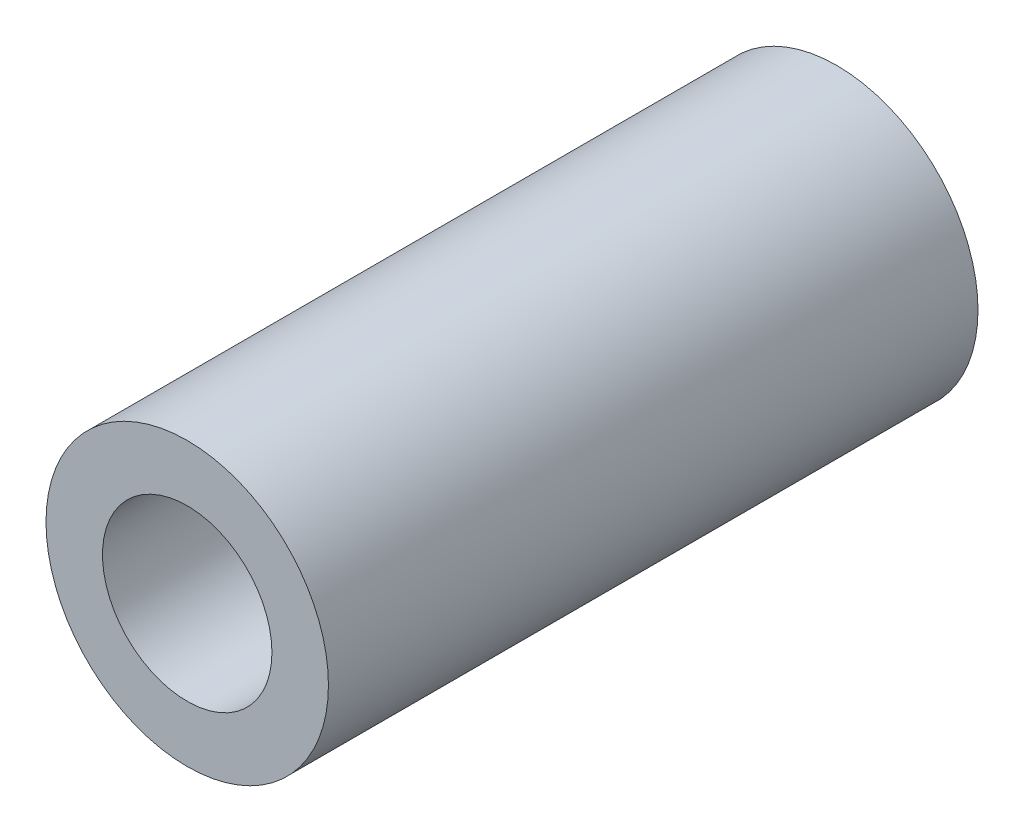
ISO-10303-21;
HEADER;
FILE_DESCRIPTION(('STEP AP214'),'2;1');
FILE_NAME('part.step','',(''),(''),'','','');
FILE_SCHEMA(('AUTOMOTIVE_DESIGN { 1 0 10303 214 1 1 1 1 }'));
ENDSEC;
DATA;
#1=APPLICATION_CONTEXT('core data for automotive mechanical design processes');
#2=APPLICATION_PROTOCOL_DEFINITION('international standard','automotive_design',2000,#1);
#3=PRODUCT_CONTEXT('',#1,'mechanical');
#4=PRODUCT('Part','Part','',(#3));
#5=PRODUCT_RELATED_PRODUCT_CATEGORY('part','',(#4));
#6=PRODUCT_DEFINITION_FORMATION('','',#4);
#7=PRODUCT_DEFINITION_CONTEXT('part definition',#1,'design');
#8=PRODUCT_DEFINITION('design','',#6,#7);
#9=PRODUCT_DEFINITION_SHAPE('','',#8);
#10=(LENGTH_UNIT() NAMED_UNIT(*) SI_UNIT(.MILLI.,.METRE.));
#11=(NAMED_UNIT(*) PLANE_ANGLE_UNIT() SI_UNIT($,.RADIAN.));
#12=(NAMED_UNIT(*) SI_UNIT($,.STERADIAN.) SOLID_ANGLE_UNIT());
#13=UNCERTAINTY_MEASURE_WITH_UNIT(LENGTH_MEASURE(1.E-05),#10,'distance_accuracy_value','');
#14=(GEOMETRIC_REPRESENTATION_CONTEXT(3) GLOBAL_UNCERTAINTY_ASSIGNED_CONTEXT((#13)) GLOBAL_UNIT_ASSIGNED_CONTEXT((#10,
#11,#12)) REPRESENTATION_CONTEXT('',''));
#15=CARTESIAN_POINT('',(0.,0.,0.));
#16=DIRECTION('',(0.,0.,1.));
#17=DIRECTION('',(1.,0.,0.));
#18=AXIS2_PLACEMENT_3D('',#15,#16,#17);
#19=CARTESIAN_POINT('',(0.,0.,23.));
#20=DIRECTION('',(0.,0.,1.));
#21=DIRECTION('',(1.,0.,0.));
#22=AXIS2_PLACEMENT_3D('',#19,#20,#21);
#23=PLANE('',#22);
#24=CARTESIAN_POINT('',(0.,0.,23.));
#25=DIRECTION('',(0.,0.,1.));
#26=DIRECTION('',(1.,0.,0.));
#27=AXIS2_PLACEMENT_3D('',#24,#25,#26);
#28=CIRCLE('',#27,5.);
#29=CARTESIAN_POINT('',(5.,0.,23.));
#30=VERTEX_POINT('',#29);
#31=EDGE_CURVE('E10',#30,#30,#28,.T.);
#32=ORIENTED_EDGE('',*,*,#31,.T.);
#33=EDGE_LOOP('',(#32));
#34=FACE_BOUND('',#33,.T.);
#35=CARTESIAN_POINT('',(0.,0.,23.));
#36=DIRECTION('',(0.,0.,1.));
#37=DIRECTION('',(1.,0.,0.));
#38=AXIS2_PLACEMENT_3D('',#35,#36,#37);
#39=CIRCLE('',#38,3.);
#40=CARTESIAN_POINT('',(3.,0.,23.));
#41=VERTEX_POINT('',#40);
#42=EDGE_CURVE('E46',#41,#41,#39,.T.);
#43=ORIENTED_EDGE('',*,*,#42,.F.);
#44=EDGE_LOOP('',(#43));
#45=FACE_BOUND('',#44,.T.);
#46=ADVANCED_FACE('F35',(#34,#45),#23,.T.);
#47=CARTESIAN_POINT('',(0.,0.,0.));
#48=DIRECTION('',(0.,0.,1.));
#49=DIRECTION('',(1.,0.,0.));
#50=AXIS2_PLACEMENT_3D('',#47,#48,#49);
#51=PLANE('',#50);
#52=CARTESIAN_POINT('',(0.,0.,0.));
#53=DIRECTION('',(0.,0.,1.));
#54=DIRECTION('',(1.,0.,0.));
#55=AXIS2_PLACEMENT_3D('',#52,#53,#54);
#56=CIRCLE('',#55,5.);
#57=CARTESIAN_POINT('',(5.,0.,0.));
#58=VERTEX_POINT('',#57);
#59=EDGE_CURVE('E39',#58,#58,#56,.T.);
#60=ORIENTED_EDGE('',*,*,#59,.F.);
#61=EDGE_LOOP('',(#60));
#62=FACE_BOUND('',#61,.T.);
#63=CARTESIAN_POINT('',(0.,0.,0.));
#64=DIRECTION('',(0.,0.,1.));
#65=DIRECTION('',(1.,0.,0.));
#66=AXIS2_PLACEMENT_3D('',#63,#64,#65);
#67=CIRCLE('',#66,3.);
#68=CARTESIAN_POINT('',(3.,0.,0.));
#69=VERTEX_POINT('',#68);
#70=EDGE_CURVE('E48',#69,#69,#67,.T.);
#71=ORIENTED_EDGE('',*,*,#70,.T.);
#72=EDGE_LOOP('',(#71));
#73=FACE_BOUND('',#72,.T.);
#74=ADVANCED_FACE('F58',(#62,#73),#51,.F.);
#75=CARTESIAN_POINT('',(0.,0.,23.));
#76=DIRECTION('',(0.,0.,-1.));
#77=DIRECTION('',(-1.,0.,0.));
#78=AXIS2_PLACEMENT_3D('',#75,#76,#77);
#79=CYLINDRICAL_SURFACE('',#78,5.);
#80=ORIENTED_EDGE('',*,*,#31,.F.);
#81=EDGE_LOOP('',(#80));
#82=FACE_BOUND('',#81,.T.);
#83=ORIENTED_EDGE('',*,*,#59,.T.);
#84=EDGE_LOOP('',(#83));
#85=FACE_BOUND('',#84,.T.);
#86=ADVANCED_FACE('F37',(#82,#85),#79,.T.);
#87=CARTESIAN_POINT('',(0.,0.,23.));
#88=DIRECTION('',(0.,0.,-1.));
#89=DIRECTION('',(-1.,0.,0.));
#90=AXIS2_PLACEMENT_3D('',#87,#88,#89);
#91=CYLINDRICAL_SURFACE('',#90,3.);
#92=ORIENTED_EDGE('',*,*,#42,.T.);
#93=EDGE_LOOP('',(#92));
#94=FACE_BOUND('',#93,.T.);
#95=ORIENTED_EDGE('',*,*,#70,.F.);
#96=EDGE_LOOP('',(#95));
#97=FACE_BOUND('',#96,.T.);
#98=ADVANCED_FACE('F54',(#94,#97),#91,.F.);
#99=CLOSED_SHELL('',(#46,#74,#86,#98));
#100=MANIFOLD_SOLID_BREP('B2',#99);
#101=ADVANCED_BREP_SHAPE_REPRESENTATION('',(#18,#100),#14);
#102=SHAPE_DEFINITION_REPRESENTATION(#9,#101);
ENDSEC;
END-ISO-10303-21;
